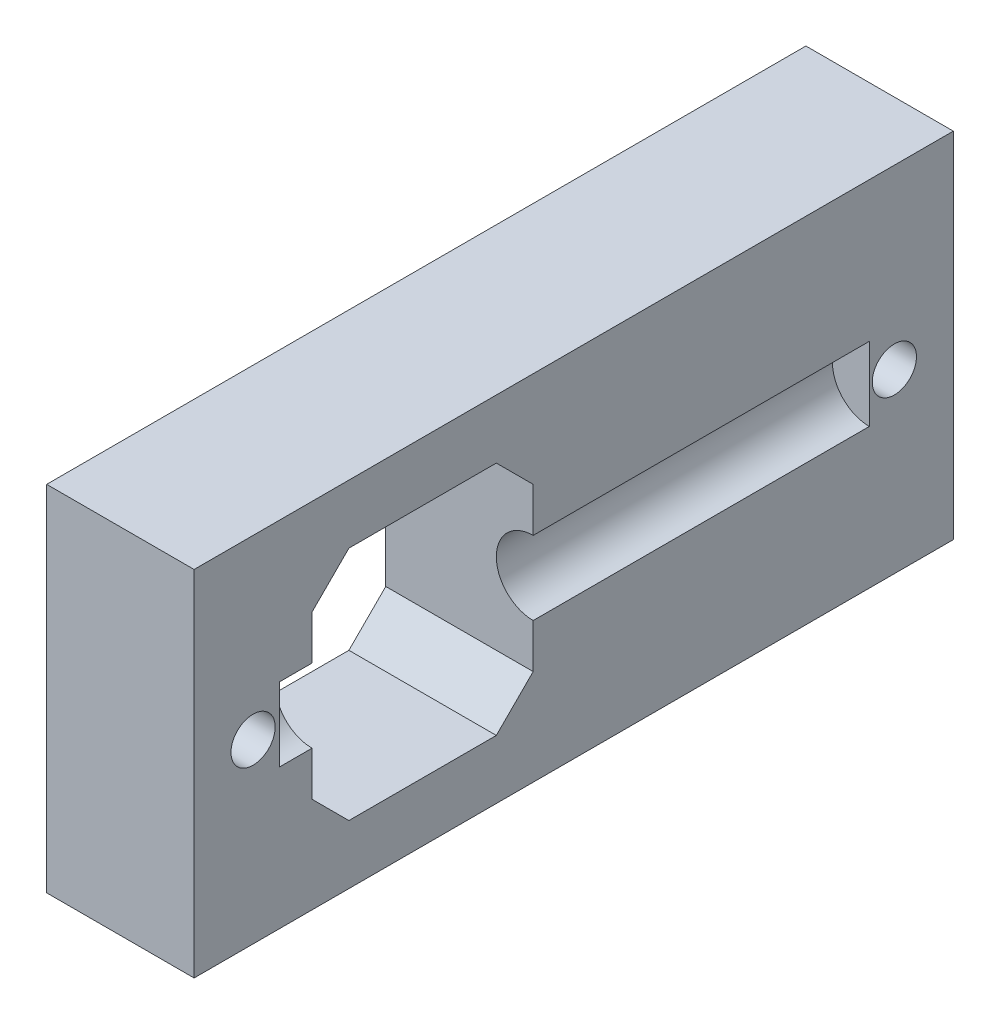
ISO-10303-21;
HEADER;
FILE_DESCRIPTION(('STEP AP214'),'2;1');
FILE_NAME('part.step','',(''),(''),'','','');
FILE_SCHEMA(('AUTOMOTIVE_DESIGN { 1 0 10303 214 1 1 1 1 }'));
ENDSEC;
DATA;
#1=APPLICATION_CONTEXT('core data for automotive mechanical design processes');
#2=APPLICATION_PROTOCOL_DEFINITION('international standard','automotive_design',2000,#1);
#3=PRODUCT_CONTEXT('',#1,'mechanical');
#4=PRODUCT('Part','Part','',(#3));
#5=PRODUCT_RELATED_PRODUCT_CATEGORY('part','',(#4));
#6=PRODUCT_DEFINITION_FORMATION('','',#4);
#7=PRODUCT_DEFINITION_CONTEXT('part definition',#1,'design');
#8=PRODUCT_DEFINITION('design','',#6,#7);
#9=PRODUCT_DEFINITION_SHAPE('','',#8);
#10=(LENGTH_UNIT() NAMED_UNIT(*) SI_UNIT(.MILLI.,.METRE.));
#11=(NAMED_UNIT(*) PLANE_ANGLE_UNIT() SI_UNIT($,.RADIAN.));
#12=(NAMED_UNIT(*) SI_UNIT($,.STERADIAN.) SOLID_ANGLE_UNIT());
#13=UNCERTAINTY_MEASURE_WITH_UNIT(LENGTH_MEASURE(1.E-05),#10,'distance_accuracy_value','');
#14=(GEOMETRIC_REPRESENTATION_CONTEXT(3) GLOBAL_UNCERTAINTY_ASSIGNED_CONTEXT((#13)) GLOBAL_UNIT_ASSIGNED_CONTEXT((#10,
#11,#12)) REPRESENTATION_CONTEXT('',''));
#15=CARTESIAN_POINT('',(0.,0.,0.));
#16=DIRECTION('',(0.,0.,1.));
#17=DIRECTION('',(1.,0.,0.));
#18=AXIS2_PLACEMENT_3D('',#15,#16,#17);
#19=CARTESIAN_POINT('',(0.,0.,0.));
#20=DIRECTION('',(1.,0.,0.));
#21=DIRECTION('',(0.,0.,-1.));
#22=AXIS2_PLACEMENT_3D('',#19,#20,#21);
#23=PLANE('',#22);
#24=CARTESIAN_POINT('',(0.,0.,62.));
#25=DIRECTION('',(1.,0.,0.));
#26=DIRECTION('',(0.,0.,-1.));
#27=AXIS2_PLACEMENT_3D('',#24,#25,#26);
#28=CIRCLE('',#27,1.5);
#29=CARTESIAN_POINT('',(0.,0.,60.5));
#30=VERTEX_POINT('',#29);
#31=EDGE_CURVE('E213',#30,#30,#28,.T.);
#32=ORIENTED_EDGE('',*,*,#31,.T.);
#33=EDGE_LOOP('',(#32));
#34=FACE_BOUND('',#33,.T.);
#35=CARTESIAN_POINT('',(0.,0.,18.5));
#36=DIRECTION('',(1.,0.,0.));
#37=DIRECTION('',(0.,0.,-1.));
#38=AXIS2_PLACEMENT_3D('',#35,#36,#37);
#39=CIRCLE('',#38,1.5);
#40=CARTESIAN_POINT('',(0.,0.,17.));
#41=VERTEX_POINT('',#40);
#42=EDGE_CURVE('E209',#41,#41,#39,.T.);
#43=ORIENTED_EDGE('',*,*,#42,.T.);
#44=EDGE_LOOP('',(#43));
#45=FACE_BOUND('',#44,.T.);
#46=DIRECTION('',(0.,1.,0.));
#47=VECTOR('',#46,1.);
#48=CARTESIAN_POINT('',(0.,12.,14.5));
#49=LINE('',#48,#47);
#50=CARTESIAN_POINT('',(0.,-12.,14.5));
#51=VERTEX_POINT('',#50);
#52=CARTESIAN_POINT('',(0.,12.,14.5));
#53=VERTEX_POINT('',#52);
#54=EDGE_CURVE('E219',#51,#53,#49,.T.);
#55=ORIENTED_EDGE('',*,*,#54,.F.);
#56=DIRECTION('',(0.,0.,1.));
#57=VECTOR('',#56,1.);
#58=CARTESIAN_POINT('',(0.,-12.,0.));
#59=LINE('',#58,#57);
#60=CARTESIAN_POINT('',(0.,-12.,66.));
#61=VERTEX_POINT('',#60);
#62=EDGE_CURVE('E164',#51,#61,#59,.T.);
#63=ORIENTED_EDGE('',*,*,#62,.T.);
#64=DIRECTION('',(0.,1.,0.));
#65=VECTOR('',#64,1.);
#66=CARTESIAN_POINT('',(0.,12.,66.));
#67=LINE('',#66,#65);
#68=CARTESIAN_POINT('',(0.,12.,66.));
#69=VERTEX_POINT('',#68);
#70=EDGE_CURVE('E160',#61,#69,#67,.T.);
#71=ORIENTED_EDGE('',*,*,#70,.T.);
#72=DIRECTION('',(0.,0.,1.));
#73=VECTOR('',#72,1.);
#74=CARTESIAN_POINT('',(0.,12.,0.));
#75=LINE('',#74,#73);
#76=EDGE_CURVE('E358',#53,#69,#75,.T.);
#77=ORIENTED_EDGE('',*,*,#76,.F.);
#78=EDGE_LOOP('',(#55,#63,#71,#77));
#79=FACE_BOUND('',#78,.T.);
#80=DIRECTION('',(0.,0.,1.));
#81=VECTOR('',#80,1.);
#82=CARTESIAN_POINT('',(0.,-8.,43.));
#83=LINE('',#82,#81);
#84=CARTESIAN_POINT('',(0.,-8.,45.5));
#85=VERTEX_POINT('',#84);
#86=CARTESIAN_POINT('',(0.,-8.,55.5));
#87=VERTEX_POINT('',#86);
#88=EDGE_CURVE('E336',#85,#87,#83,.T.);
#89=ORIENTED_EDGE('',*,*,#88,.F.);
#90=DIRECTION('',(0.,0.707106781186544,-0.707106781186551));
#91=VECTOR('',#90,1.);
#92=CARTESIAN_POINT('',(0.,-8.,45.5));
#93=LINE('',#92,#91);
#94=CARTESIAN_POINT('',(0.,-5.50000000000001,43.));
#95=VERTEX_POINT('',#94);
#96=EDGE_CURVE('E339',#95,#85,#93,.F.);
#97=ORIENTED_EDGE('',*,*,#96,.F.);
#98=DIRECTION('',(0.,-1.,0.));
#99=VECTOR('',#98,1.);
#100=CARTESIAN_POINT('',(0.,8.,43.));
#101=LINE('',#100,#99);
#102=CARTESIAN_POINT('',(0.,5.49999999999999,43.));
#103=VERTEX_POINT('',#102);
#104=EDGE_CURVE('E341',#103,#95,#101,.T.);
#105=ORIENTED_EDGE('',*,*,#104,.F.);
#106=DIRECTION('',(0.,0.707106781186551,0.707106781186544));
#107=VECTOR('',#106,1.);
#108=CARTESIAN_POINT('',(0.,5.49999999999999,43.));
#109=LINE('',#108,#107);
#110=CARTESIAN_POINT('',(0.,8.,45.5));
#111=VERTEX_POINT('',#110);
#112=EDGE_CURVE('E346',#111,#103,#109,.F.);
#113=ORIENTED_EDGE('',*,*,#112,.F.);
#114=DIRECTION('',(0.,0.,-1.));
#115=VECTOR('',#114,1.);
#116=CARTESIAN_POINT('',(0.,8.,43.));
#117=LINE('',#116,#115);
#118=CARTESIAN_POINT('',(0.,8.,55.5));
#119=VERTEX_POINT('',#118);
#120=EDGE_CURVE('E349',#119,#111,#117,.T.);
#121=ORIENTED_EDGE('',*,*,#120,.F.);
#122=DIRECTION('',(0.,-0.707106781186544,0.707106781186551));
#123=VECTOR('',#122,1.);
#124=CARTESIAN_POINT('',(0.,8.,55.5));
#125=LINE('',#124,#123);
#126=CARTESIAN_POINT('',(0.,5.50000000000001,58.));
#127=VERTEX_POINT('',#126);
#128=EDGE_CURVE('E352',#127,#119,#125,.F.);
#129=ORIENTED_EDGE('',*,*,#128,.F.);
#130=DIRECTION('',(0.,1.,0.));
#131=VECTOR('',#130,1.);
#132=CARTESIAN_POINT('',(0.,8.,58.));
#133=LINE('',#132,#131);
#134=CARTESIAN_POINT('',(0.,-5.49999999999998,58.));
#135=VERTEX_POINT('',#134);
#136=EDGE_CURVE('E355',#135,#127,#133,.T.);
#137=ORIENTED_EDGE('',*,*,#136,.F.);
#138=DIRECTION('',(0.,-0.707106781186551,-0.707106781186544));
#139=VECTOR('',#138,1.);
#140=CARTESIAN_POINT('',(0.,-5.49999999999998,58.));
#141=LINE('',#140,#139);
#142=EDGE_CURVE('E189',#87,#135,#141,.F.);
#143=ORIENTED_EDGE('',*,*,#142,.F.);
#144=EDGE_LOOP('',(#89,#97,#105,#113,#121,#129,#137,#143));
#145=FACE_BOUND('',#144,.T.);
#146=ADVANCED_FACE('F33',(#34,#45,#79,#145),#23,.F.);
#147=CARTESIAN_POINT('',(10.,0.,0.));
#148=DIRECTION('',(1.,0.,0.));
#149=DIRECTION('',(0.,0.,-1.));
#150=AXIS2_PLACEMENT_3D('',#147,#148,#149);
#151=PLANE('',#150);
#152=DIRECTION('',(0.,0.,1.));
#153=VECTOR('',#152,1.);
#154=CARTESIAN_POINT('',(10.,2.5,20.2));
#155=LINE('',#154,#153);
#156=CARTESIAN_POINT('',(10.,2.5,20.2));
#157=VERTEX_POINT('',#156);
#158=CARTESIAN_POINT('',(10.,2.5,43.));
#159=VERTEX_POINT('',#158);
#160=EDGE_CURVE('E48',#157,#159,#155,.T.);
#161=ORIENTED_EDGE('',*,*,#160,.F.);
#162=DIRECTION('',(0.,-1.,0.));
#163=VECTOR('',#162,1.);
#164=CARTESIAN_POINT('',(10.,0.,20.2));
#165=LINE('',#164,#163);
#166=CARTESIAN_POINT('',(10.,-2.5,20.2));
#167=VERTEX_POINT('',#166);
#168=EDGE_CURVE('E11',#157,#167,#165,.T.);
#169=ORIENTED_EDGE('',*,*,#168,.T.);
#170=DIRECTION('',(0.,0.,1.));
#171=VECTOR('',#170,1.);
#172=CARTESIAN_POINT('',(10.,-2.5,20.2));
#173=LINE('',#172,#171);
#174=CARTESIAN_POINT('',(10.,-2.5,43.));
#175=VERTEX_POINT('',#174);
#176=EDGE_CURVE('E152',#175,#167,#173,.F.);
#177=ORIENTED_EDGE('',*,*,#176,.F.);
#178=DIRECTION('',(0.,1.,0.));
#179=VECTOR('',#178,1.);
#180=CARTESIAN_POINT('',(10.,-5.50000000000001,43.));
#181=LINE('',#180,#179);
#182=CARTESIAN_POINT('',(10.,-5.50000000000001,43.));
#183=VERTEX_POINT('',#182);
#184=EDGE_CURVE('E200',#183,#175,#181,.T.);
#185=ORIENTED_EDGE('',*,*,#184,.F.);
#186=DIRECTION('',(0.,0.707106781186543,-0.707106781186551));
#187=VECTOR('',#186,1.);
#188=CARTESIAN_POINT('',(10.,-8.,45.5));
#189=LINE('',#188,#187);
#190=CARTESIAN_POINT('',(10.,-8.,45.5));
#191=VERTEX_POINT('',#190);
#192=EDGE_CURVE('E197',#191,#183,#189,.T.);
#193=ORIENTED_EDGE('',*,*,#192,.F.);
#194=DIRECTION('',(0.,0.,-1.));
#195=VECTOR('',#194,1.);
#196=CARTESIAN_POINT('',(10.,-8.,55.5));
#197=LINE('',#196,#195);
#198=CARTESIAN_POINT('',(10.,-8.,55.5));
#199=VERTEX_POINT('',#198);
#200=EDGE_CURVE('E194',#199,#191,#197,.T.);
#201=ORIENTED_EDGE('',*,*,#200,.F.);
#202=DIRECTION('',(0.,-0.707106781186551,-0.707106781186543));
#203=VECTOR('',#202,1.);
#204=CARTESIAN_POINT('',(10.,-5.49999999999998,58.));
#205=LINE('',#204,#203);
#206=CARTESIAN_POINT('',(10.,-5.49999999999998,58.));
#207=VERTEX_POINT('',#206);
#208=EDGE_CURVE('E180',#207,#199,#205,.T.);
#209=ORIENTED_EDGE('',*,*,#208,.F.);
#210=DIRECTION('',(0.,-1.,0.));
#211=VECTOR('',#210,1.);
#212=CARTESIAN_POINT('',(10.,5.50000000000001,58.));
#213=LINE('',#212,#211);
#214=CARTESIAN_POINT('',(10.,-2.5,58.));
#215=VERTEX_POINT('',#214);
#216=EDGE_CURVE('E177',#215,#207,#213,.T.);
#217=ORIENTED_EDGE('',*,*,#216,.F.);
#218=CARTESIAN_POINT('',(10.,-2.5,60.2));
#219=VERTEX_POINT('',#218);
#220=EDGE_CURVE('E56',#219,#215,#173,.F.);
#221=ORIENTED_EDGE('',*,*,#220,.F.);
#222=DIRECTION('',(0.,-1.,0.));
#223=VECTOR('',#222,1.);
#224=CARTESIAN_POINT('',(10.,0.,60.2));
#225=LINE('',#224,#223);
#226=CARTESIAN_POINT('',(10.,2.5,60.2));
#227=VERTEX_POINT('',#226);
#228=EDGE_CURVE('E41',#227,#219,#225,.T.);
#229=ORIENTED_EDGE('',*,*,#228,.F.);
#230=CARTESIAN_POINT('',(10.,2.5,58.));
#231=VERTEX_POINT('',#230);
#232=EDGE_CURVE('E162',#231,#227,#155,.T.);
#233=ORIENTED_EDGE('',*,*,#232,.F.);
#234=CARTESIAN_POINT('',(10.,5.50000000000001,58.));
#235=VERTEX_POINT('',#234);
#236=EDGE_CURVE('E184',#235,#231,#213,.T.);
#237=ORIENTED_EDGE('',*,*,#236,.F.);
#238=DIRECTION('',(0.,-0.707106781186544,0.707106781186551));
#239=VECTOR('',#238,1.);
#240=CARTESIAN_POINT('',(10.,8.,55.5));
#241=LINE('',#240,#239);
#242=CARTESIAN_POINT('',(10.,8.,55.5));
#243=VERTEX_POINT('',#242);
#244=EDGE_CURVE('E185',#243,#235,#241,.T.);
#245=ORIENTED_EDGE('',*,*,#244,.F.);
#246=DIRECTION('',(0.,0.,1.));
#247=VECTOR('',#246,1.);
#248=CARTESIAN_POINT('',(10.,8.,45.5));
#249=LINE('',#248,#247);
#250=CARTESIAN_POINT('',(10.,8.,45.5));
#251=VERTEX_POINT('',#250);
#252=EDGE_CURVE('E206',#251,#243,#249,.T.);
#253=ORIENTED_EDGE('',*,*,#252,.F.);
#254=DIRECTION('',(0.,0.707106781186551,0.707106781186544));
#255=VECTOR('',#254,1.);
#256=CARTESIAN_POINT('',(10.,5.49999999999999,43.));
#257=LINE('',#256,#255);
#258=CARTESIAN_POINT('',(10.,5.49999999999999,43.));
#259=VERTEX_POINT('',#258);
#260=EDGE_CURVE('E203',#259,#251,#257,.T.);
#261=ORIENTED_EDGE('',*,*,#260,.F.);
#262=EDGE_CURVE('E159',#159,#259,#181,.T.);
#263=ORIENTED_EDGE('',*,*,#262,.F.);
#264=EDGE_LOOP('',(#161,#169,#177,#185,#193,#201,#209,#217,#221,#229,#233,#237,#245,#253,#261,#263));
#265=FACE_BOUND('',#264,.T.);
#266=CARTESIAN_POINT('',(10.,0.,62.));
#267=DIRECTION('',(1.,0.,0.));
#268=DIRECTION('',(0.,0.,-1.));
#269=AXIS2_PLACEMENT_3D('',#266,#267,#268);
#270=CIRCLE('',#269,1.5);
#271=CARTESIAN_POINT('',(10.,0.,60.5));
#272=VERTEX_POINT('',#271);
#273=EDGE_CURVE('E216',#272,#272,#270,.T.);
#274=ORIENTED_EDGE('',*,*,#273,.F.);
#275=EDGE_LOOP('',(#274));
#276=FACE_BOUND('',#275,.T.);
#277=DIRECTION('',(0.,-1.,0.));
#278=VECTOR('',#277,1.);
#279=CARTESIAN_POINT('',(10.,12.,66.));
#280=LINE('',#279,#278);
#281=CARTESIAN_POINT('',(10.,12.,66.));
#282=VERTEX_POINT('',#281);
#283=CARTESIAN_POINT('',(10.,-12.,66.));
#284=VERTEX_POINT('',#283);
#285=EDGE_CURVE('E222',#282,#284,#280,.T.);
#286=ORIENTED_EDGE('',*,*,#285,.T.);
#287=DIRECTION('',(0.,0.,-1.));
#288=VECTOR('',#287,1.);
#289=CARTESIAN_POINT('',(10.,-12.,66.));
#290=LINE('',#289,#288);
#291=CARTESIAN_POINT('',(10.,-12.,14.5));
#292=VERTEX_POINT('',#291);
#293=EDGE_CURVE('E225',#284,#292,#290,.T.);
#294=ORIENTED_EDGE('',*,*,#293,.T.);
#295=DIRECTION('',(0.,1.,0.));
#296=VECTOR('',#295,1.);
#297=CARTESIAN_POINT('',(10.,12.,14.5));
#298=LINE('',#297,#296);
#299=CARTESIAN_POINT('',(10.,12.,14.5));
#300=VERTEX_POINT('',#299);
#301=EDGE_CURVE('E227',#292,#300,#298,.T.);
#302=ORIENTED_EDGE('',*,*,#301,.T.);
#303=DIRECTION('',(0.,0.,1.));
#304=VECTOR('',#303,1.);
#305=CARTESIAN_POINT('',(10.,12.,66.));
#306=LINE('',#305,#304);
#307=EDGE_CURVE('E230',#300,#282,#306,.T.);
#308=ORIENTED_EDGE('',*,*,#307,.T.);
#309=EDGE_LOOP('',(#286,#294,#302,#308));
#310=FACE_BOUND('',#309,.T.);
#311=CARTESIAN_POINT('',(10.,0.,18.5));
#312=DIRECTION('',(1.,0.,0.));
#313=DIRECTION('',(0.,0.,-1.));
#314=AXIS2_PLACEMENT_3D('',#311,#312,#313);
#315=CIRCLE('',#314,1.5);
#316=CARTESIAN_POINT('',(10.,0.,17.));
#317=VERTEX_POINT('',#316);
#318=EDGE_CURVE('E210',#317,#317,#315,.T.);
#319=ORIENTED_EDGE('',*,*,#318,.F.);
#320=EDGE_LOOP('',(#319));
#321=FACE_BOUND('',#320,.T.);
#322=ADVANCED_FACE('F156',(#265,#276,#310,#321),#151,.T.);
#323=CARTESIAN_POINT('',(10.,12.,14.5));
#324=DIRECTION('',(0.,0.,1.));
#325=DIRECTION('',(0.,-1.,0.));
#326=AXIS2_PLACEMENT_3D('',#323,#324,#325);
#327=PLANE('',#326);
#328=ORIENTED_EDGE('',*,*,#54,.T.);
#329=DIRECTION('',(-1.,0.,0.));
#330=VECTOR('',#329,1.);
#331=CARTESIAN_POINT('',(10.,12.,14.5));
#332=LINE('',#331,#330);
#333=EDGE_CURVE('E232',#300,#53,#332,.T.);
#334=ORIENTED_EDGE('',*,*,#333,.F.);
#335=ORIENTED_EDGE('',*,*,#301,.F.);
#336=DIRECTION('',(-1.,0.,0.));
#337=VECTOR('',#336,1.);
#338=CARTESIAN_POINT('',(10.,-12.,14.5));
#339=LINE('',#338,#337);
#340=EDGE_CURVE('E236',#292,#51,#339,.T.);
#341=ORIENTED_EDGE('',*,*,#340,.T.);
#342=EDGE_LOOP('',(#328,#334,#335,#341));
#343=FACE_BOUND('',#342,.T.);
#344=ADVANCED_FACE('F281',(#343),#327,.F.);
#345=CARTESIAN_POINT('',(10.,0.,62.));
#346=DIRECTION('',(-1.,0.,0.));
#347=DIRECTION('',(0.,0.,1.));
#348=AXIS2_PLACEMENT_3D('',#345,#346,#347);
#349=CYLINDRICAL_SURFACE('',#348,1.5);
#350=ORIENTED_EDGE('',*,*,#273,.T.);
#351=EDGE_LOOP('',(#350));
#352=FACE_BOUND('',#351,.T.);
#353=ORIENTED_EDGE('',*,*,#31,.F.);
#354=EDGE_LOOP('',(#353));
#355=FACE_BOUND('',#354,.T.);
#356=ADVANCED_FACE('F288',(#352,#355),#349,.F.);
#357=CARTESIAN_POINT('',(10.,0.,18.5));
#358=DIRECTION('',(-1.,0.,0.));
#359=DIRECTION('',(0.,0.,1.));
#360=AXIS2_PLACEMENT_3D('',#357,#358,#359);
#361=CYLINDRICAL_SURFACE('',#360,1.5);
#362=ORIENTED_EDGE('',*,*,#318,.T.);
#363=EDGE_LOOP('',(#362));
#364=FACE_BOUND('',#363,.T.);
#365=ORIENTED_EDGE('',*,*,#42,.F.);
#366=EDGE_LOOP('',(#365));
#367=FACE_BOUND('',#366,.T.);
#368=ADVANCED_FACE('F325',(#364,#367),#361,.F.);
#369=CARTESIAN_POINT('',(0.,-5.49999999999998,58.));
#370=DIRECTION('',(0.,0.707106781186543,-0.707106781186551));
#371=DIRECTION('',(1.,0.,0.));
#372=AXIS2_PLACEMENT_3D('',#369,#370,#371);
#373=PLANE('',#372);
#374=DIRECTION('',(1.,0.,0.));
#375=VECTOR('',#374,1.);
#376=CARTESIAN_POINT('',(0.,-8.,55.5));
#377=LINE('',#376,#375);
#378=EDGE_CURVE('E243',#87,#199,#377,.T.);
#379=ORIENTED_EDGE('',*,*,#378,.F.);
#380=ORIENTED_EDGE('',*,*,#142,.T.);
#381=DIRECTION('',(-1.,0.,0.));
#382=VECTOR('',#381,1.);
#383=CARTESIAN_POINT('',(-21.,-5.49999999999998,58.));
#384=LINE('',#383,#382);
#385=EDGE_CURVE('E262',#207,#135,#384,.T.);
#386=ORIENTED_EDGE('',*,*,#385,.F.);
#387=ORIENTED_EDGE('',*,*,#208,.T.);
#388=EDGE_LOOP('',(#379,#380,#386,#387));
#389=FACE_BOUND('',#388,.T.);
#390=ADVANCED_FACE('F303',(#389),#373,.T.);
#391=CARTESIAN_POINT('',(0.,-8.,43.));
#392=DIRECTION('',(0.,-1.,0.));
#393=DIRECTION('',(0.,0.,-1.));
#394=AXIS2_PLACEMENT_3D('',#391,#392,#393);
#395=PLANE('',#394);
#396=DIRECTION('',(-1.,0.,0.));
#397=VECTOR('',#396,1.);
#398=CARTESIAN_POINT('',(-21.,-8.,45.5));
#399=LINE('',#398,#397);
#400=EDGE_CURVE('E247',#191,#85,#399,.T.);
#401=ORIENTED_EDGE('',*,*,#400,.T.);
#402=ORIENTED_EDGE('',*,*,#88,.T.);
#403=ORIENTED_EDGE('',*,*,#378,.T.);
#404=ORIENTED_EDGE('',*,*,#200,.T.);
#405=EDGE_LOOP('',(#401,#402,#403,#404));
#406=FACE_BOUND('',#405,.T.);
#407=ADVANCED_FACE('F299',(#406),#395,.F.);
#408=CARTESIAN_POINT('',(0.,-8.,45.5));
#409=DIRECTION('',(0.,0.707106781186551,0.707106781186543));
#410=DIRECTION('',(1.,0.,0.));
#411=AXIS2_PLACEMENT_3D('',#408,#409,#410);
#412=PLANE('',#411);
#413=DIRECTION('',(1.,0.,0.));
#414=VECTOR('',#413,1.);
#415=CARTESIAN_POINT('',(0.,-5.50000000000001,43.));
#416=LINE('',#415,#414);
#417=EDGE_CURVE('E253',#95,#183,#416,.T.);
#418=ORIENTED_EDGE('',*,*,#417,.F.);
#419=ORIENTED_EDGE('',*,*,#96,.T.);
#420=ORIENTED_EDGE('',*,*,#400,.F.);
#421=ORIENTED_EDGE('',*,*,#192,.T.);
#422=EDGE_LOOP('',(#418,#419,#420,#421));
#423=FACE_BOUND('',#422,.T.);
#424=ADVANCED_FACE('F302',(#423),#412,.T.);
#425=CARTESIAN_POINT('',(0.,8.,43.));
#426=DIRECTION('',(0.,0.,-1.));
#427=DIRECTION('',(-1.,0.,0.));
#428=AXIS2_PLACEMENT_3D('',#425,#426,#427);
#429=PLANE('',#428);
#430=ORIENTED_EDGE('',*,*,#184,.T.);
#431=CARTESIAN_POINT('',(10.,0.,43.));
#432=DIRECTION('',(0.,0.,-1.));
#433=DIRECTION('',(-1.,0.,0.));
#434=AXIS2_PLACEMENT_3D('',#431,#432,#433);
#435=CIRCLE('',#434,2.5);
#436=EDGE_CURVE('E166',#175,#159,#435,.T.);
#437=ORIENTED_EDGE('',*,*,#436,.T.);
#438=ORIENTED_EDGE('',*,*,#262,.T.);
#439=DIRECTION('',(-1.,0.,0.));
#440=VECTOR('',#439,1.);
#441=CARTESIAN_POINT('',(-21.,5.49999999999999,43.));
#442=LINE('',#441,#440);
#443=EDGE_CURVE('E250',#259,#103,#442,.T.);
#444=ORIENTED_EDGE('',*,*,#443,.T.);
#445=ORIENTED_EDGE('',*,*,#104,.T.);
#446=ORIENTED_EDGE('',*,*,#417,.T.);
#447=EDGE_LOOP('',(#430,#437,#438,#444,#445,#446));
#448=FACE_BOUND('',#447,.T.);
#449=ADVANCED_FACE('F305',(#448),#429,.F.);
#450=CARTESIAN_POINT('',(0.,5.49999999999999,43.));
#451=DIRECTION('',(0.,-0.707106781186544,0.707106781186551));
#452=DIRECTION('',(1.,0.,0.));
#453=AXIS2_PLACEMENT_3D('',#450,#451,#452);
#454=PLANE('',#453);
#455=DIRECTION('',(1.,0.,0.));
#456=VECTOR('',#455,1.);
#457=CARTESIAN_POINT('',(0.,8.,45.5));
#458=LINE('',#457,#456);
#459=EDGE_CURVE('E258',#111,#251,#458,.T.);
#460=ORIENTED_EDGE('',*,*,#459,.F.);
#461=ORIENTED_EDGE('',*,*,#112,.T.);
#462=ORIENTED_EDGE('',*,*,#443,.F.);
#463=ORIENTED_EDGE('',*,*,#260,.T.);
#464=EDGE_LOOP('',(#460,#461,#462,#463));
#465=FACE_BOUND('',#464,.T.);
#466=ADVANCED_FACE('F293',(#465),#454,.T.);
#467=CARTESIAN_POINT('',(0.,8.,43.));
#468=DIRECTION('',(0.,1.,0.));
#469=DIRECTION('',(0.,0.,1.));
#470=AXIS2_PLACEMENT_3D('',#467,#468,#469);
#471=PLANE('',#470);
#472=DIRECTION('',(-1.,0.,0.));
#473=VECTOR('',#472,1.);
#474=CARTESIAN_POINT('',(-21.,8.,55.5));
#475=LINE('',#474,#473);
#476=EDGE_CURVE('E255',#243,#119,#475,.T.);
#477=ORIENTED_EDGE('',*,*,#476,.T.);
#478=ORIENTED_EDGE('',*,*,#120,.T.);
#479=ORIENTED_EDGE('',*,*,#459,.T.);
#480=ORIENTED_EDGE('',*,*,#252,.T.);
#481=EDGE_LOOP('',(#477,#478,#479,#480));
#482=FACE_BOUND('',#481,.T.);
#483=ADVANCED_FACE('F290',(#482),#471,.F.);
#484=CARTESIAN_POINT('',(0.,8.,55.5));
#485=DIRECTION('',(0.,-0.707106781186551,-0.707106781186544));
#486=DIRECTION('',(1.,0.,0.));
#487=AXIS2_PLACEMENT_3D('',#484,#485,#486);
#488=PLANE('',#487);
#489=DIRECTION('',(1.,0.,0.));
#490=VECTOR('',#489,1.);
#491=CARTESIAN_POINT('',(0.,5.50000000000001,58.));
#492=LINE('',#491,#490);
#493=EDGE_CURVE('E260',#127,#235,#492,.T.);
#494=ORIENTED_EDGE('',*,*,#493,.F.);
#495=ORIENTED_EDGE('',*,*,#128,.T.);
#496=ORIENTED_EDGE('',*,*,#476,.F.);
#497=ORIENTED_EDGE('',*,*,#244,.T.);
#498=EDGE_LOOP('',(#494,#495,#496,#497));
#499=FACE_BOUND('',#498,.T.);
#500=ADVANCED_FACE('F35',(#499),#488,.T.);
#501=CARTESIAN_POINT('',(0.,8.,58.));
#502=DIRECTION('',(0.,0.,1.));
#503=DIRECTION('',(1.,0.,0.));
#504=AXIS2_PLACEMENT_3D('',#501,#502,#503);
#505=PLANE('',#504);
#506=ORIENTED_EDGE('',*,*,#236,.T.);
#507=CARTESIAN_POINT('',(10.,0.,58.));
#508=DIRECTION('',(0.,0.,1.));
#509=DIRECTION('',(1.,0.,0.));
#510=AXIS2_PLACEMENT_3D('',#507,#508,#509);
#511=CIRCLE('',#510,2.5);
#512=EDGE_CURVE('E264',#231,#215,#511,.T.);
#513=ORIENTED_EDGE('',*,*,#512,.T.);
#514=ORIENTED_EDGE('',*,*,#216,.T.);
#515=ORIENTED_EDGE('',*,*,#385,.T.);
#516=ORIENTED_EDGE('',*,*,#136,.T.);
#517=ORIENTED_EDGE('',*,*,#493,.T.);
#518=EDGE_LOOP('',(#506,#513,#514,#515,#516,#517));
#519=FACE_BOUND('',#518,.T.);
#520=ADVANCED_FACE('F295',(#519),#505,.F.);
#521=CARTESIAN_POINT('',(0.,-12.,40.));
#522=DIRECTION('',(0.,-1.,0.));
#523=DIRECTION('',(0.,0.,-1.));
#524=AXIS2_PLACEMENT_3D('',#521,#522,#523);
#525=PLANE('',#524);
#526=ORIENTED_EDGE('',*,*,#62,.F.);
#527=ORIENTED_EDGE('',*,*,#340,.F.);
#528=ORIENTED_EDGE('',*,*,#293,.F.);
#529=DIRECTION('',(-1.,0.,0.));
#530=VECTOR('',#529,1.);
#531=CARTESIAN_POINT('',(0.,-12.,66.));
#532=LINE('',#531,#530);
#533=EDGE_CURVE('E239',#284,#61,#532,.T.);
#534=ORIENTED_EDGE('',*,*,#533,.T.);
#535=EDGE_LOOP('',(#526,#527,#528,#534));
#536=FACE_BOUND('',#535,.T.);
#537=ADVANCED_FACE('F298',(#536),#525,.T.);
#538=CARTESIAN_POINT('',(0.,12.,66.));
#539=DIRECTION('',(0.,0.,1.));
#540=DIRECTION('',(1.,0.,0.));
#541=AXIS2_PLACEMENT_3D('',#538,#539,#540);
#542=PLANE('',#541);
#543=ORIENTED_EDGE('',*,*,#70,.F.);
#544=ORIENTED_EDGE('',*,*,#533,.F.);
#545=ORIENTED_EDGE('',*,*,#285,.F.);
#546=DIRECTION('',(-1.,0.,0.));
#547=VECTOR('',#546,1.);
#548=CARTESIAN_POINT('',(0.,12.,66.));
#549=LINE('',#548,#547);
#550=EDGE_CURVE('E240',#282,#69,#549,.T.);
#551=ORIENTED_EDGE('',*,*,#550,.T.);
#552=EDGE_LOOP('',(#543,#544,#545,#551));
#553=FACE_BOUND('',#552,.T.);
#554=ADVANCED_FACE('F311',(#553),#542,.T.);
#555=CARTESIAN_POINT('',(0.,12.,40.));
#556=DIRECTION('',(0.,1.,0.));
#557=DIRECTION('',(0.,0.,1.));
#558=AXIS2_PLACEMENT_3D('',#555,#556,#557);
#559=PLANE('',#558);
#560=ORIENTED_EDGE('',*,*,#76,.T.);
#561=ORIENTED_EDGE('',*,*,#550,.F.);
#562=ORIENTED_EDGE('',*,*,#307,.F.);
#563=ORIENTED_EDGE('',*,*,#333,.T.);
#564=EDGE_LOOP('',(#560,#561,#562,#563));
#565=FACE_BOUND('',#564,.T.);
#566=ADVANCED_FACE('F273',(#565),#559,.T.);
#567=CARTESIAN_POINT('',(10.,0.,20.2));
#568=DIRECTION('',(0.,0.,1.));
#569=DIRECTION('',(1.,0.,0.));
#570=AXIS2_PLACEMENT_3D('',#567,#568,#569);
#571=CYLINDRICAL_SURFACE('',#570,2.5);
#572=ORIENTED_EDGE('',*,*,#232,.T.);
#573=CARTESIAN_POINT('',(10.,0.,60.2));
#574=DIRECTION('',(0.,0.,1.));
#575=DIRECTION('',(1.,0.,0.));
#576=AXIS2_PLACEMENT_3D('',#573,#574,#575);
#577=CIRCLE('',#576,2.5);
#578=EDGE_CURVE('E153',#227,#219,#577,.T.);
#579=ORIENTED_EDGE('',*,*,#578,.T.);
#580=ORIENTED_EDGE('',*,*,#220,.T.);
#581=ORIENTED_EDGE('',*,*,#512,.F.);
#582=EDGE_LOOP('',(#572,#579,#580,#581));
#583=FACE_BOUND('',#582,.T.);
#584=ADVANCED_FACE('F172',(#583),#571,.F.);
#585=CARTESIAN_POINT('',(10.,0.,60.2));
#586=DIRECTION('',(0.,0.,1.));
#587=DIRECTION('',(1.,0.,0.));
#588=AXIS2_PLACEMENT_3D('',#585,#586,#587);
#589=PLANE('',#588);
#590=ORIENTED_EDGE('',*,*,#228,.T.);
#591=ORIENTED_EDGE('',*,*,#578,.F.);
#592=EDGE_LOOP('',(#590,#591));
#593=FACE_BOUND('',#592,.T.);
#594=ADVANCED_FACE('F265',(#593),#589,.F.);
#595=ORIENTED_EDGE('',*,*,#160,.T.);
#596=ORIENTED_EDGE('',*,*,#436,.F.);
#597=ORIENTED_EDGE('',*,*,#176,.T.);
#598=CARTESIAN_POINT('',(10.,0.,20.2));
#599=DIRECTION('',(0.,0.,1.));
#600=DIRECTION('',(1.,0.,0.));
#601=AXIS2_PLACEMENT_3D('',#598,#599,#600);
#602=CIRCLE('',#601,2.5);
#603=EDGE_CURVE('E148',#157,#167,#602,.T.);
#604=ORIENTED_EDGE('',*,*,#603,.F.);
#605=EDGE_LOOP('',(#595,#596,#597,#604));
#606=FACE_BOUND('',#605,.T.);
#607=ADVANCED_FACE('F151',(#606),#571,.F.);
#608=CARTESIAN_POINT('',(10.,0.,20.2));
#609=DIRECTION('',(0.,0.,1.));
#610=DIRECTION('',(1.,0.,0.));
#611=AXIS2_PLACEMENT_3D('',#608,#609,#610);
#612=PLANE('',#611);
#613=ORIENTED_EDGE('',*,*,#603,.T.);
#614=ORIENTED_EDGE('',*,*,#168,.F.);
#615=EDGE_LOOP('',(#613,#614));
#616=FACE_BOUND('',#615,.T.);
#617=ADVANCED_FACE('F147',(#616),#612,.T.);
#618=CLOSED_SHELL('',(#146,#322,#344,#356,#368,#390,#407,#424,#449,#466,#483,#500,#520,#537,
#554,#566,#584,#594,#607,#617));
#619=MANIFOLD_SOLID_BREP('B2',#618);
#620=ADVANCED_BREP_SHAPE_REPRESENTATION('',(#18,#619),#14);
#621=SHAPE_DEFINITION_REPRESENTATION(#9,#620);
ENDSEC;
END-ISO-10303-21;
